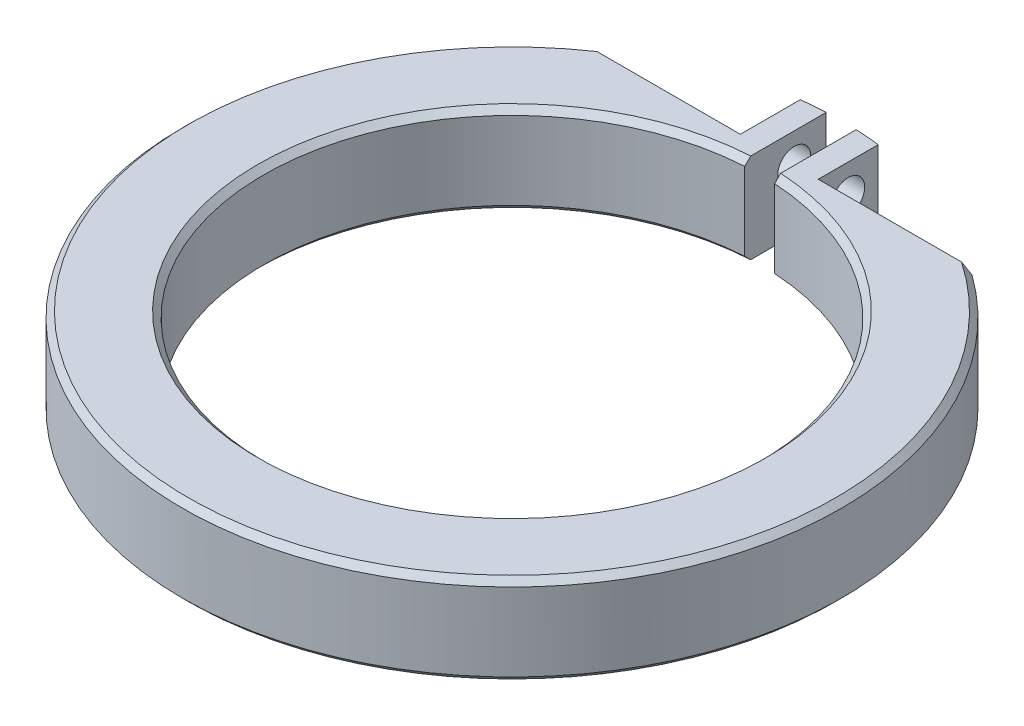
ISO-10303-21;
HEADER;
FILE_DESCRIPTION(('STEP AP214'),'2;1');
FILE_NAME('part.step','',(''),(''),'','','');
FILE_SCHEMA(('AUTOMOTIVE_DESIGN { 1 0 10303 214 1 1 1 1 }'));
ENDSEC;
DATA;
#1=APPLICATION_CONTEXT('core data for automotive mechanical design processes');
#2=APPLICATION_PROTOCOL_DEFINITION('international standard','automotive_design',2000,#1);
#3=PRODUCT_CONTEXT('',#1,'mechanical');
#4=PRODUCT('Part','Part','',(#3));
#5=PRODUCT_RELATED_PRODUCT_CATEGORY('part','',(#4));
#6=PRODUCT_DEFINITION_FORMATION('','',#4);
#7=PRODUCT_DEFINITION_CONTEXT('part definition',#1,'design');
#8=PRODUCT_DEFINITION('design','',#6,#7);
#9=PRODUCT_DEFINITION_SHAPE('','',#8);
#10=(LENGTH_UNIT() NAMED_UNIT(*) SI_UNIT(.MILLI.,.METRE.));
#11=(NAMED_UNIT(*) PLANE_ANGLE_UNIT() SI_UNIT($,.RADIAN.));
#12=(NAMED_UNIT(*) SI_UNIT($,.STERADIAN.) SOLID_ANGLE_UNIT());
#13=UNCERTAINTY_MEASURE_WITH_UNIT(LENGTH_MEASURE(1.E-05),#10,'distance_accuracy_value','');
#14=(GEOMETRIC_REPRESENTATION_CONTEXT(3) GLOBAL_UNCERTAINTY_ASSIGNED_CONTEXT((#13)) GLOBAL_UNIT_ASSIGNED_CONTEXT((#10,
#11,#12)) REPRESENTATION_CONTEXT('',''));
#15=CARTESIAN_POINT('',(0.,0.,0.));
#16=DIRECTION('',(0.,0.,1.));
#17=DIRECTION('',(1.,0.,0.));
#18=AXIS2_PLACEMENT_3D('',#15,#16,#17);
#19=CARTESIAN_POINT('',(0.,15.,0.));
#20=DIRECTION('',(0.,1.,0.));
#21=DIRECTION('',(0.,0.,1.));
#22=AXIS2_PLACEMENT_3D('',#19,#20,#21);
#23=PLANE('',#22);
#24=DIRECTION('',(0.,0.,-1.));
#25=VECTOR('',#24,1.);
#26=CARTESIAN_POINT('',(2.5,15.,-41.3419799507716));
#27=LINE('',#26,#25);
#28=CARTESIAN_POINT('',(2.5,15.,-42.3437634870827));
#29=VERTEX_POINT('',#28);
#30=CARTESIAN_POINT('',(2.50000000000001,15.,-54.9431524395898));
#31=VERTEX_POINT('',#30);
#32=EDGE_CURVE('E186',#29,#31,#27,.T.);
#33=ORIENTED_EDGE('',*,*,#32,.F.);
#34=CARTESIAN_POINT('',(0.,15.,0.));
#35=DIRECTION('',(0.,1.,0.));
#36=DIRECTION('',(0.,0.,1.));
#37=AXIS2_PLACEMENT_3D('',#34,#35,#36);
#38=CIRCLE('',#37,42.4175);
#39=CARTESIAN_POINT('',(-2.5,15.,-42.3437634870827));
#40=VERTEX_POINT('',#39);
#41=EDGE_CURVE('E11',#29,#40,#38,.F.);
#42=ORIENTED_EDGE('',*,*,#41,.T.);
#43=DIRECTION('',(0.,0.,1.));
#44=VECTOR('',#43,1.);
#45=CARTESIAN_POINT('',(-2.5,15.,-41.3419799507716));
#46=LINE('',#45,#44);
#47=CARTESIAN_POINT('',(-2.5,15.,-54.9431524395898));
#48=VERTEX_POINT('',#47);
#49=EDGE_CURVE('E210',#48,#40,#46,.T.);
#50=ORIENTED_EDGE('',*,*,#49,.F.);
#51=CARTESIAN_POINT('',(0.,15.,0.));
#52=DIRECTION('',(0.,1.,0.));
#53=DIRECTION('',(0.,0.,1.));
#54=AXIS2_PLACEMENT_3D('',#51,#52,#53);
#55=CIRCLE('',#54,55.);
#56=CARTESIAN_POINT('',(-6.5,15.,-54.6145584986275));
#57=VERTEX_POINT('',#56);
#58=EDGE_CURVE('E178',#48,#57,#55,.T.);
#59=ORIENTED_EDGE('',*,*,#58,.T.);
#60=DIRECTION('',(0.,0.,-1.));
#61=VECTOR('',#60,1.);
#62=CARTESIAN_POINT('',(-6.5,15.,-54.6145584986275));
#63=LINE('',#62,#61);
#64=CARTESIAN_POINT('',(-6.5,15.,-44.6145584986275));
#65=VERTEX_POINT('',#64);
#66=EDGE_CURVE('E164',#65,#57,#63,.T.);
#67=ORIENTED_EDGE('',*,*,#66,.F.);
#68=DIRECTION('',(1.,0.,0.));
#69=VECTOR('',#68,1.);
#70=CARTESIAN_POINT('',(-6.5,15.,-44.6145584986275));
#71=LINE('',#70,#69);
#72=CARTESIAN_POINT('',(-30.4227081301542,15.,-44.6145584986274));
#73=VERTEX_POINT('',#72);
#74=EDGE_CURVE('E153',#73,#65,#71,.T.);
#75=ORIENTED_EDGE('',*,*,#74,.F.);
#76=CARTESIAN_POINT('',(0.,15.,0.));
#77=DIRECTION('',(0.,1.,0.));
#78=DIRECTION('',(0.,0.,1.));
#79=AXIS2_PLACEMENT_3D('',#76,#77,#78);
#80=CIRCLE('',#79,54.);
#81=CARTESIAN_POINT('',(30.4227081301542,15.,-44.6145584986274));
#82=VERTEX_POINT('',#81);
#83=EDGE_CURVE('E396',#73,#82,#80,.T.);
#84=ORIENTED_EDGE('',*,*,#83,.T.);
#85=DIRECTION('',(1.,0.,0.));
#86=VECTOR('',#85,1.);
#87=CARTESIAN_POINT('',(6.5,15.,-44.6145584986275));
#88=LINE('',#87,#86);
#89=CARTESIAN_POINT('',(6.5,15.,-44.6145584986275));
#90=VERTEX_POINT('',#89);
#91=EDGE_CURVE('E192',#90,#82,#88,.T.);
#92=ORIENTED_EDGE('',*,*,#91,.F.);
#93=DIRECTION('',(0.,0.,1.));
#94=VECTOR('',#93,1.);
#95=CARTESIAN_POINT('',(6.5,15.,-54.6145584986275));
#96=LINE('',#95,#94);
#97=CARTESIAN_POINT('',(6.5,15.,-54.6145584986275));
#98=VERTEX_POINT('',#97);
#99=EDGE_CURVE('E196',#98,#90,#96,.T.);
#100=ORIENTED_EDGE('',*,*,#99,.F.);
#101=EDGE_CURVE('E218',#98,#31,#55,.T.);
#102=ORIENTED_EDGE('',*,*,#101,.T.);
#103=EDGE_LOOP('',(#33,#42,#50,#59,#67,#75,#84,#92,#100,#102));
#104=FACE_BOUND('',#103,.T.);
#105=ADVANCED_FACE('F37',(#104),#23,.T.);
#106=CARTESIAN_POINT('',(0.,0.,0.));
#107=DIRECTION('',(0.,1.,0.));
#108=DIRECTION('',(0.,0.,1.));
#109=AXIS2_PLACEMENT_3D('',#106,#107,#108);
#110=PLANE('',#109);
#111=DIRECTION('',(0.,0.,1.));
#112=VECTOR('',#111,1.);
#113=CARTESIAN_POINT('',(-2.5,0.,-41.3419799507716));
#114=LINE('',#113,#112);
#115=CARTESIAN_POINT('',(-2.5,0.,-53.9420985872815));
#116=VERTEX_POINT('',#115);
#117=CARTESIAN_POINT('',(-2.5,0.,-42.3437634870827));
#118=VERTEX_POINT('',#117);
#119=EDGE_CURVE('E209',#116,#118,#114,.T.);
#120=ORIENTED_EDGE('',*,*,#119,.T.);
#121=CARTESIAN_POINT('',(0.,0.,0.));
#122=DIRECTION('',(0.,1.,0.));
#123=DIRECTION('',(0.,0.,1.));
#124=AXIS2_PLACEMENT_3D('',#121,#122,#123);
#125=CIRCLE('',#124,42.4175);
#126=CARTESIAN_POINT('',(2.5,0.,-42.3437634870827));
#127=VERTEX_POINT('',#126);
#128=EDGE_CURVE('E381',#118,#127,#125,.T.);
#129=ORIENTED_EDGE('',*,*,#128,.T.);
#130=DIRECTION('',(0.,0.,-1.));
#131=VECTOR('',#130,1.);
#132=CARTESIAN_POINT('',(2.5,0.,-41.3419799507716));
#133=LINE('',#132,#131);
#134=CARTESIAN_POINT('',(2.5,0.,-53.9420985872815));
#135=VERTEX_POINT('',#134);
#136=EDGE_CURVE('E207',#127,#135,#133,.T.);
#137=ORIENTED_EDGE('',*,*,#136,.T.);
#138=CARTESIAN_POINT('',(0.,0.,0.));
#139=DIRECTION('',(0.,1.,0.));
#140=DIRECTION('',(0.,0.,1.));
#141=AXIS2_PLACEMENT_3D('',#138,#139,#140);
#142=CIRCLE('',#141,54.);
#143=EDGE_CURVE('E384',#135,#116,#142,.F.);
#144=ORIENTED_EDGE('',*,*,#143,.T.);
#145=EDGE_LOOP('',(#120,#129,#137,#144));
#146=FACE_BOUND('',#145,.T.);
#147=ADVANCED_FACE('F416',(#146),#110,.F.);
#148=CARTESIAN_POINT('',(0.,15.,0.));
#149=DIRECTION('',(0.,-1.,0.));
#150=DIRECTION('',(0.,0.,-1.));
#151=AXIS2_PLACEMENT_3D('',#148,#149,#150);
#152=CYLINDRICAL_SURFACE('',#151,55.);
#153=DIRECTION('',(0.,1.,0.));
#154=VECTOR('',#153,1.);
#155=CARTESIAN_POINT('',(32.1642840736826,5.,-44.6145584986274));
#156=LINE('',#155,#154);
#157=CARTESIAN_POINT('',(32.1642840736826,7.,-44.6145584986274));
#158=VERTEX_POINT('',#157);
#159=CARTESIAN_POINT('',(32.1642840736826,14.,-44.6145584986274));
#160=VERTEX_POINT('',#159);
#161=EDGE_CURVE('E165',#158,#160,#156,.T.);
#162=ORIENTED_EDGE('',*,*,#161,.T.);
#163=CARTESIAN_POINT('',(0.,14.,0.));
#164=DIRECTION('',(0.,1.,0.));
#165=DIRECTION('',(0.,0.,1.));
#166=AXIS2_PLACEMENT_3D('',#163,#164,#165);
#167=CIRCLE('',#166,55.);
#168=CARTESIAN_POINT('',(-32.1642840736826,14.,-44.6145584986274));
#169=VERTEX_POINT('',#168);
#170=EDGE_CURVE('E297',#160,#169,#167,.F.);
#171=ORIENTED_EDGE('',*,*,#170,.T.);
#172=DIRECTION('',(0.,1.,0.));
#173=VECTOR('',#172,1.);
#174=CARTESIAN_POINT('',(-32.1642840736826,5.,-44.6145584986274));
#175=LINE('',#174,#173);
#176=CARTESIAN_POINT('',(-32.1642840736826,7.,-44.6145584986274));
#177=VERTEX_POINT('',#176);
#178=EDGE_CURVE('E174',#177,#169,#175,.T.);
#179=ORIENTED_EDGE('',*,*,#178,.F.);
#180=CARTESIAN_POINT('',(-32.1642840736826,7.,-44.6145584986274));
#181=CARTESIAN_POINT('',(-32.1643007930241,6.95962654996886,-44.6145458588829));
#182=CARTESIAN_POINT('',(-32.1625889999668,6.91926554770767,-44.6157805302863));
#183=CARTESIAN_POINT('',(-32.1558383664156,6.83901869520496,-44.6206464551745));
#184=CARTESIAN_POINT('',(-32.1508037826462,6.79913230342107,-44.6242746423976));
#185=CARTESIAN_POINT('',(-32.1376164344037,6.7206527281823,-44.6337727601258));
#186=CARTESIAN_POINT('',(-32.1295017608624,6.68204977529407,-44.6396153047959));
#187=CARTESIAN_POINT('',(-32.1103702607454,6.6059539996012,-44.6533790601372));
#188=CARTESIAN_POINT('',(-32.0993527118299,6.56846145569297,-44.6613007881821));
#189=CARTESIAN_POINT('',(-32.0624414049865,6.45841174838379,-44.6878144789277));
#190=CARTESIAN_POINT('',(-32.0326055683359,6.38781396457675,-44.7092152345839));
#191=CARTESIAN_POINT('',(-31.9644894091069,6.25290586522998,-44.7579398251131));
#192=CARTESIAN_POINT('',(-31.9261815324406,6.18861707713267,-44.7852829816436));
#193=CARTESIAN_POINT('',(-31.8203085100542,6.0332174427758,-44.8606078665391));
#194=CARTESIAN_POINT('',(-31.7482128027911,5.94670884784141,-44.9116894360233));
#195=CARTESIAN_POINT('',(-31.5937875931604,5.78834388503713,-45.0204571304663));
#196=CARTESIAN_POINT('',(-31.5114378583423,5.71651724795518,-45.0781562944737));
#197=CARTESIAN_POINT('',(-31.3547501014121,5.59710350456871,-45.187245316554));
#198=CARTESIAN_POINT('',(-31.2814946507567,5.54747277963951,-45.2379971710635));
#199=CARTESIAN_POINT('',(-31.1314531874134,5.45604765513646,-45.3413820614901));
#200=CARTESIAN_POINT('',(-31.0546648215676,5.4142585755384,-45.3940163458795));
#201=CARTESIAN_POINT('',(-30.8981822449858,5.33759542300357,-45.5006740409138));
#202=CARTESIAN_POINT('',(-30.8184782061336,5.30274790323949,-45.5547019253211));
#203=CARTESIAN_POINT('',(-30.6570430183275,5.23947550200878,-45.6634996036769));
#204=CARTESIAN_POINT('',(-30.5753113309136,5.21105234729605,-45.7182695929068));
#205=CARTESIAN_POINT('',(-30.3868374511277,5.15283220921085,-45.843825213226));
#206=CARTESIAN_POINT('',(-30.2795908446476,5.12494198124811,-45.9147372344463));
#207=CARTESIAN_POINT('',(-30.0632331561396,5.07792506055661,-46.0566908920685));
#208=CARTESIAN_POINT('',(-29.9541211799253,5.05880270035894,-46.1277325751718));
#209=CARTESIAN_POINT('',(-29.7362916235818,5.0288806120298,-46.2684503752386));
#210=CARTESIAN_POINT('',(-29.6275933720868,5.01795849583825,-46.3381308042381));
#211=CARTESIAN_POINT('',(-29.4094898289416,5.00353665055713,-46.4768615567524));
#212=CARTESIAN_POINT('',(-29.3000855751165,5.00002778026472,-46.5459125516248));
#213=CARTESIAN_POINT('',(-29.1904596739764,5.,-46.6145584986274));
#214=B_SPLINE_CURVE_WITH_KNOTS('',3,(#180,#181,#182,#183,#184,#185,#186,#187,#188,#189,#190,
#191,#192,#193,#194,#195,#196,#197,#198,#199,#200,#201,#202,#203,#204,#205,#206,#207,#208,#209,
#210,#211,#212,#213),.UNSPECIFIED.,.F.,.F.,(4,2,2,2,2,2,2,2,2,2,2,2,2,2,2,2,4),(0.,
0.12104516813012,0.241935569244906,0.361377234494594,0.480848649244449,0.718373440455049,
0.956682414734294,1.32555498811106,1.6951672814864,2.00076537448538,2.30657004946758,
2.61352294044258,2.92055823698864,3.31488348287743,3.70940337016977,4.09791115867101,
4.48593960164287),.UNSPECIFIED.);
#215=CARTESIAN_POINT('',(-29.1904596739764,5.,-46.6145584986274));
#216=VERTEX_POINT('',#215);
#217=EDGE_CURVE('E240',#177,#216,#214,.T.);
#218=ORIENTED_EDGE('',*,*,#217,.T.);
#219=CARTESIAN_POINT('',(0.,5.,0.));
#220=DIRECTION('',(0.,1.,0.));
#221=DIRECTION('',(0.,0.,1.));
#222=AXIS2_PLACEMENT_3D('',#219,#220,#221);
#223=CIRCLE('',#222,55.);
#224=CARTESIAN_POINT('',(-6.5,5.,-54.6145584986275));
#225=VERTEX_POINT('',#224);
#226=EDGE_CURVE('E179',#225,#216,#223,.T.);
#227=ORIENTED_EDGE('',*,*,#226,.F.);
#228=DIRECTION('',(0.,1.,0.));
#229=VECTOR('',#228,1.);
#230=CARTESIAN_POINT('',(-6.5,5.,-54.6145584986275));
#231=LINE('',#230,#229);
#232=EDGE_CURVE('E173',#225,#57,#231,.T.);
#233=ORIENTED_EDGE('',*,*,#232,.T.);
#234=ORIENTED_EDGE('',*,*,#58,.F.);
#235=DIRECTION('',(0.,1.,0.));
#236=VECTOR('',#235,1.);
#237=CARTESIAN_POINT('',(-2.5,0.,-54.9431524395898));
#238=LINE('',#237,#236);
#239=CARTESIAN_POINT('',(-2.5,0.999999999999994,-54.9431524395898));
#240=VERTEX_POINT('',#239);
#241=EDGE_CURVE('E219',#240,#48,#238,.T.);
#242=ORIENTED_EDGE('',*,*,#241,.F.);
#243=CARTESIAN_POINT('',(0.,0.999999999999994,0.));
#244=DIRECTION('',(0.,1.,0.));
#245=DIRECTION('',(0.,0.,1.));
#246=AXIS2_PLACEMENT_3D('',#243,#244,#245);
#247=CIRCLE('',#246,55.);
#248=CARTESIAN_POINT('',(2.50000000000001,0.999999999999994,-54.9431524395898));
#249=VERTEX_POINT('',#248);
#250=EDGE_CURVE('E394',#240,#249,#247,.T.);
#251=ORIENTED_EDGE('',*,*,#250,.T.);
#252=DIRECTION('',(0.,1.,0.));
#253=VECTOR('',#252,1.);
#254=CARTESIAN_POINT('',(2.50000000000001,0.,-54.9431524395898));
#255=LINE('',#254,#253);
#256=EDGE_CURVE('E221',#249,#31,#255,.T.);
#257=ORIENTED_EDGE('',*,*,#256,.T.);
#258=ORIENTED_EDGE('',*,*,#101,.F.);
#259=DIRECTION('',(0.,1.,0.));
#260=VECTOR('',#259,1.);
#261=CARTESIAN_POINT('',(6.5,5.,-54.6145584986275));
#262=LINE('',#261,#260);
#263=CARTESIAN_POINT('',(6.5,5.,-54.6145584986275));
#264=VERTEX_POINT('',#263);
#265=EDGE_CURVE('E195',#264,#98,#262,.T.);
#266=ORIENTED_EDGE('',*,*,#265,.F.);
#267=CARTESIAN_POINT('',(0.,5.,0.));
#268=DIRECTION('',(0.,1.,0.));
#269=DIRECTION('',(0.,0.,-1.));
#270=AXIS2_PLACEMENT_3D('',#267,#268,#269);
#271=CIRCLE('',#270,55.);
#272=CARTESIAN_POINT('',(29.1904596739764,5.,-46.6145584986274));
#273=VERTEX_POINT('',#272);
#274=EDGE_CURVE('E189',#273,#264,#271,.T.);
#275=ORIENTED_EDGE('',*,*,#274,.F.);
#276=CARTESIAN_POINT('',(29.1904596739764,5.,-46.6145584986274));
#277=CARTESIAN_POINT('',(29.2618950582999,5.00000410830266,-46.5698251893079));
#278=CARTESIAN_POINT('',(29.3332214542748,5.00150048570252,-46.5249310861389));
#279=CARTESIAN_POINT('',(29.4755868914035,5.0075763970651,-46.4348670040117));
#280=CARTESIAN_POINT('',(29.5466258737238,5.01215653303706,-46.3896969728934));
#281=CARTESIAN_POINT('',(29.7597310130058,5.03071895077998,-46.2535066736511));
#282=CARTESIAN_POINT('',(29.9012139733787,5.04952488058544,-46.1621640296161));
#283=CARTESIAN_POINT('',(30.182670971722,5.10137602829001,-45.9786345991746));
#284=CARTESIAN_POINT('',(30.3226236335103,5.13453487780392,-45.8864469467475));
#285=CARTESIAN_POINT('',(30.5982104292876,5.21691294581438,-45.7031374911376));
#286=CARTESIAN_POINT('',(30.7338526875045,5.26609970842943,-45.6120139163039));
#287=CARTESIAN_POINT('',(30.9136296618075,5.34558281005282,-45.4901176550028));
#288=CARTESIAN_POINT('',(30.9606118537982,5.36773726369652,-45.4581531074483));
#289=CARTESIAN_POINT('',(31.0535962187872,5.41460931547153,-45.3946839265736));
#290=CARTESIAN_POINT('',(31.0995984037196,5.43932688236891,-45.3631792876545));
#291=CARTESIAN_POINT('',(31.2358324010681,5.51755206138873,-45.2695800291169));
#292=CARTESIAN_POINT('',(31.3243712222158,5.57516652162368,-45.2083460759812));
#293=CARTESIAN_POINT('',(31.4956258256684,5.70344966090385,-45.0892063366155));
#294=CARTESIAN_POINT('',(31.5782840147289,5.77422792917874,-45.0313342782552));
#295=CARTESIAN_POINT('',(31.7336467298936,5.93031105628469,-44.9219837573017));
#296=CARTESIAN_POINT('',(31.8063702734681,6.01558743878918,-44.8704930971201));
#297=CARTESIAN_POINT('',(31.9143565542687,6.16983570890459,-44.7937120687995));
#298=CARTESIAN_POINT('',(31.9539029113345,6.23433491007644,-44.765499859494));
#299=CARTESIAN_POINT('',(32.0245392338627,6.37001782794382,-44.7149948904175));
#300=CARTESIAN_POINT('',(32.0556364037224,6.44119577972369,-44.6926970879768));
#301=CARTESIAN_POINT('',(32.1035804569386,6.5789853609633,-44.6582677032646));
#302=CARTESIAN_POINT('',(32.1218028956664,6.64486834930053,-44.6451569510118));
#303=CARTESIAN_POINT('',(32.1489536197877,6.7794006321575,-44.6256101405288));
#304=CARTESIAN_POINT('',(32.1579050349218,6.84804259636878,-44.6191574715829));
#305=CARTESIAN_POINT('',(32.163494337862,6.94466530757117,-44.6151276772019));
#306=CARTESIAN_POINT('',(32.1642975804329,6.97233836171307,-44.6145483681533));
#307=CARTESIAN_POINT('',(32.1642840736826,7.,-44.6145584986274));
#308=B_SPLINE_CURVE_WITH_KNOTS('',3,(#276,#277,#278,#279,#280,#281,#282,#283,#284,#285,#286,
#287,#288,#289,#290,#291,#292,#293,#294,#295,#296,#297,#298,#299,#300,#301,#302,#303,#304,#305,
#306,#307),.UNSPECIFIED.,.F.,.F.,(4,2,2,2,2,2,2,2,2,2,2,2,2,2,2,4),(0.,0.25282771647522,
0.505704804121882,1.01347651754073,1.52534395540327,2.03618125719,2.21910112323622,
2.40201876049517,2.76754890573759,3.13627064080194,3.5042763492189,3.74577355016985,
3.98706418200524,4.19500426291173,4.40242430726866,4.48542557306862),.UNSPECIFIED.);
#309=EDGE_CURVE('E248',#273,#158,#308,.T.);
#310=ORIENTED_EDGE('',*,*,#309,.T.);
#311=EDGE_LOOP('',(#162,#171,#179,#218,#227,#233,#234,#242,#251,#257,#258,#266,#275,#310));
#312=FACE_BOUND('',#311,.T.);
#313=ADVANCED_FACE('F255',(#312),#152,.T.);
#314=CARTESIAN_POINT('',(0.,15.,0.));
#315=DIRECTION('',(0.,-1.,0.));
#316=DIRECTION('',(0.,0.,-1.));
#317=AXIS2_PLACEMENT_3D('',#314,#315,#316);
#318=CYLINDRICAL_SURFACE('',#317,41.4175);
#319=DIRECTION('',(0.,1.,0.));
#320=VECTOR('',#319,1.);
#321=CARTESIAN_POINT('',(2.5,0.,-41.3419799507716));
#322=LINE('',#321,#320);
#323=CARTESIAN_POINT('',(2.5,0.999999999999973,-41.3419799507716));
#324=VERTEX_POINT('',#323);
#325=CARTESIAN_POINT('',(2.5,14.,-41.3419799507716));
#326=VERTEX_POINT('',#325);
#327=EDGE_CURVE('E213',#324,#326,#322,.T.);
#328=ORIENTED_EDGE('',*,*,#327,.F.);
#329=CARTESIAN_POINT('',(0.,0.999999999999973,0.));
#330=DIRECTION('',(0.,1.,0.));
#331=DIRECTION('',(0.,0.,1.));
#332=AXIS2_PLACEMENT_3D('',#329,#330,#331);
#333=CIRCLE('',#332,41.4175);
#334=CARTESIAN_POINT('',(-2.5,0.999999999999973,-41.3419799507716));
#335=VERTEX_POINT('',#334);
#336=EDGE_CURVE('E344',#324,#335,#333,.F.);
#337=ORIENTED_EDGE('',*,*,#336,.T.);
#338=DIRECTION('',(0.,1.,0.));
#339=VECTOR('',#338,1.);
#340=CARTESIAN_POINT('',(-2.5,0.,-41.3419799507716));
#341=LINE('',#340,#339);
#342=CARTESIAN_POINT('',(-2.5,14.,-41.3419799507716));
#343=VERTEX_POINT('',#342);
#344=EDGE_CURVE('E216',#335,#343,#341,.T.);
#345=ORIENTED_EDGE('',*,*,#344,.T.);
#346=CARTESIAN_POINT('',(0.,14.,0.));
#347=DIRECTION('',(0.,1.,0.));
#348=DIRECTION('',(0.,0.,1.));
#349=AXIS2_PLACEMENT_3D('',#346,#347,#348);
#350=CIRCLE('',#349,41.4175);
#351=EDGE_CURVE('E365',#343,#326,#350,.T.);
#352=ORIENTED_EDGE('',*,*,#351,.T.);
#353=EDGE_LOOP('',(#328,#337,#345,#352));
#354=FACE_BOUND('',#353,.T.);
#355=ADVANCED_FACE('F376',(#354),#318,.F.);
#356=CARTESIAN_POINT('',(2.5,0.,-41.3419799507716));
#357=DIRECTION('',(1.,0.,0.));
#358=DIRECTION('',(0.,0.,-1.));
#359=AXIS2_PLACEMENT_3D('',#356,#357,#358);
#360=PLANE('',#359);
#361=CARTESIAN_POINT('',(2.5,10.,-49.6145584986275));
#362=DIRECTION('',(1.,0.,0.));
#363=DIRECTION('',(0.,0.,-1.));
#364=AXIS2_PLACEMENT_3D('',#361,#362,#363);
#365=CIRCLE('',#364,2.75);
#366=CARTESIAN_POINT('',(2.5,10.,-52.3645584986275));
#367=VERTEX_POINT('',#366);
#368=EDGE_CURVE('E199',#367,#367,#365,.T.);
#369=ORIENTED_EDGE('',*,*,#368,.T.);
#370=EDGE_LOOP('',(#369));
#371=FACE_BOUND('',#370,.T.);
#372=ORIENTED_EDGE('',*,*,#136,.F.);
#373=CARTESIAN_POINT('',(2.5,0.,-42.3437634870827));
#374=CARTESIAN_POINT('',(2.5,0.166670221879675,-42.1768031132481));
#375=CARTESIAN_POINT('',(2.5,0.33333866615273,-42.0098409649716));
#376=CARTESIAN_POINT('',(2.5,0.666671999486055,-41.6759131195346));
#377=CARTESIAN_POINT('',(2.5,0.833336888546325,-41.508947422374));
#378=CARTESIAN_POINT('',(2.5,0.999999999999975,-41.3419799507716));
#379=B_SPLINE_CURVE_WITH_KNOTS('',3,(#373,#374,#375,#376,#377,#378),.UNSPECIFIED.,.F.,.F.,(4,2,
4),(0.,0.707737637448653,1.41547527489923),.UNSPECIFIED.);
#380=EDGE_CURVE('E359',#127,#324,#379,.T.);
#381=ORIENTED_EDGE('',*,*,#380,.T.);
#382=ORIENTED_EDGE('',*,*,#327,.T.);
#383=CARTESIAN_POINT('',(2.5,14.,-41.3419799507716));
#384=CARTESIAN_POINT('',(2.5,14.1666631114536,-41.508947422374));
#385=CARTESIAN_POINT('',(2.5,14.3333280005139,-41.6759131195346));
#386=CARTESIAN_POINT('',(2.5,14.6666613338473,-42.0098409649716));
#387=CARTESIAN_POINT('',(2.5,14.8333297781203,-42.1768031132481));
#388=CARTESIAN_POINT('',(2.5,15.,-42.3437634870827));
#389=B_SPLINE_CURVE_WITH_KNOTS('',3,(#383,#384,#385,#386,#387,#388),.UNSPECIFIED.,.F.,.F.,(4,2,
4),(0.,0.707737637450602,1.41547527489929),.UNSPECIFIED.);
#390=EDGE_CURVE('E366',#326,#29,#389,.T.);
#391=ORIENTED_EDGE('',*,*,#390,.T.);
#392=ORIENTED_EDGE('',*,*,#32,.T.);
#393=ORIENTED_EDGE('',*,*,#256,.F.);
#394=CARTESIAN_POINT('',(2.50000000000001,0.999999999999994,-54.9431524395898));
#395=CARTESIAN_POINT('',(2.50000000000001,0.83333171939114,-54.7763117431149));
#396=CARTESIAN_POINT('',(2.5,0.666664245753398,-54.6094702405185));
#397=CARTESIAN_POINT('',(2.5,0.333330912420066,-54.2757856230824));
#398=CARTESIAN_POINT('',(2.5,0.166665052724476,-54.1089425082428));
#399=CARTESIAN_POINT('',(2.5,0.,-53.9420985872815));
#400=B_SPLINE_CURVE_WITH_KNOTS('',3,(#394,#395,#396,#397,#398,#399),.UNSPECIFIED.,.F.,.F.,(4,2,
4),(0.,0.707479472364236,1.41495894472878),.UNSPECIFIED.);
#401=EDGE_CURVE('E296',#249,#135,#400,.T.);
#402=ORIENTED_EDGE('',*,*,#401,.T.);
#403=EDGE_LOOP('',(#372,#381,#382,#391,#392,#393,#402));
#404=FACE_BOUND('',#403,.T.);
#405=ADVANCED_FACE('F325',(#371,#404),#360,.F.);
#406=CARTESIAN_POINT('',(-2.5,0.,-41.3419799507716));
#407=DIRECTION('',(-1.,0.,0.));
#408=DIRECTION('',(0.,0.,1.));
#409=AXIS2_PLACEMENT_3D('',#406,#407,#408);
#410=PLANE('',#409);
#411=CARTESIAN_POINT('',(-2.5,10.,-49.6145584986274));
#412=DIRECTION('',(-1.,0.,0.));
#413=DIRECTION('',(0.,0.,1.));
#414=AXIS2_PLACEMENT_3D('',#411,#412,#413);
#415=CIRCLE('',#414,2.75);
#416=CARTESIAN_POINT('',(-2.5,10.,-46.8645584986274));
#417=VERTEX_POINT('',#416);
#418=EDGE_CURVE('E554',#417,#417,#415,.T.);
#419=ORIENTED_EDGE('',*,*,#418,.T.);
#420=EDGE_LOOP('',(#419));
#421=FACE_BOUND('',#420,.T.);
#422=ORIENTED_EDGE('',*,*,#344,.F.);
#423=CARTESIAN_POINT('',(-2.5,0.999999999999973,-41.3419799507716));
#424=CARTESIAN_POINT('',(-2.5,0.833336888546325,-41.508947422374));
#425=CARTESIAN_POINT('',(-2.5,0.666671999486057,-41.6759131195346));
#426=CARTESIAN_POINT('',(-2.5,0.333338666152733,-42.0098409649716));
#427=CARTESIAN_POINT('',(-2.5,0.166670221879677,-42.1768031132481));
#428=CARTESIAN_POINT('',(-2.5,0.,-42.3437634870827));
#429=B_SPLINE_CURVE_WITH_KNOTS('',3,(#423,#424,#425,#426,#427,#428),.UNSPECIFIED.,.F.,.F.,(4,2,
4),(0.,0.70773763745057,1.41547527489923),.UNSPECIFIED.);
#430=EDGE_CURVE('E47',#335,#118,#429,.T.);
#431=ORIENTED_EDGE('',*,*,#430,.T.);
#432=ORIENTED_EDGE('',*,*,#119,.F.);
#433=CARTESIAN_POINT('',(-2.5,0.,-53.9420985872815));
#434=CARTESIAN_POINT('',(-2.5,0.166665052724475,-54.1089425082428));
#435=CARTESIAN_POINT('',(-2.5,0.333330912420064,-54.2757856230824));
#436=CARTESIAN_POINT('',(-2.5,0.666664245753395,-54.6094702405185));
#437=CARTESIAN_POINT('',(-2.5,0.833331719391138,-54.7763117431149));
#438=CARTESIAN_POINT('',(-2.5,0.999999999999994,-54.9431524395898));
#439=B_SPLINE_CURVE_WITH_KNOTS('',3,(#433,#434,#435,#436,#437,#438),.UNSPECIFIED.,.F.,.F.,(4,2,
4),(0.,0.707479472364545,1.41495894472878),.UNSPECIFIED.);
#440=EDGE_CURVE('E332',#116,#240,#439,.T.);
#441=ORIENTED_EDGE('',*,*,#440,.T.);
#442=ORIENTED_EDGE('',*,*,#241,.T.);
#443=ORIENTED_EDGE('',*,*,#49,.T.);
#444=CARTESIAN_POINT('',(-2.5,15.,-42.3437634870827));
#445=CARTESIAN_POINT('',(-2.5,14.8333297781203,-42.1768031132481));
#446=CARTESIAN_POINT('',(-2.5,14.6666613338473,-42.0098409649716));
#447=CARTESIAN_POINT('',(-2.5,14.3333280005139,-41.6759131195346));
#448=CARTESIAN_POINT('',(-2.5,14.1666631114536,-41.508947422374));
#449=CARTESIAN_POINT('',(-2.5,14.,-41.3419799507716));
#450=B_SPLINE_CURVE_WITH_KNOTS('',3,(#444,#445,#446,#447,#448,#449),.UNSPECIFIED.,.F.,.F.,(4,2,
4),(0.,0.707737637448692,1.41547527489929),.UNSPECIFIED.);
#451=EDGE_CURVE('E59',#40,#343,#450,.T.);
#452=ORIENTED_EDGE('',*,*,#451,.T.);
#453=EDGE_LOOP('',(#422,#431,#432,#441,#442,#443,#452));
#454=FACE_BOUND('',#453,.T.);
#455=ADVANCED_FACE('F318',(#421,#454),#410,.F.);
#456=CARTESIAN_POINT('',(6.5,5.,-44.6145584986275));
#457=DIRECTION('',(0.,0.,1.));
#458=DIRECTION('',(1.,0.,0.));
#459=AXIS2_PLACEMENT_3D('',#456,#457,#458);
#460=PLANE('',#459);
#461=ORIENTED_EDGE('',*,*,#91,.T.);
#462=CARTESIAN_POINT('',(30.4227081301542,15.,-44.6145584986274));
#463=CARTESIAN_POINT('',(30.7143132558915,14.8356712441181,-44.6145584986274));
#464=CARTESIAN_POINT('',(31.0052471688844,14.6701735202692,-44.6145584986274));
#465=CARTESIAN_POINT('',(31.5857724829943,14.3368401862401,-44.6145584986274));
#466=CARTESIAN_POINT('',(31.8753638845109,14.1690045767556,-44.6145584986274));
#467=CARTESIAN_POINT('',(32.1642840736826,14.,-44.6145584986274));
#468=B_SPLINE_CURVE_WITH_KNOTS('',3,(#462,#463,#464,#465,#466,#467),.UNSPECIFIED.,.F.,.F.,(4,2,
4),(0.,1.00413562079871,2.00827094274987),.UNSPECIFIED.);
#469=EDGE_CURVE('E281',#82,#160,#468,.T.);
#470=ORIENTED_EDGE('',*,*,#469,.T.);
#471=ORIENTED_EDGE('',*,*,#161,.F.);
#472=DIRECTION('',(1.,0.,0.));
#473=VECTOR('',#472,1.);
#474=CARTESIAN_POINT('',(6.5,7.,-44.6145584986275));
#475=LINE('',#474,#473);
#476=CARTESIAN_POINT('',(6.5,7.,-44.6145584986275));
#477=VERTEX_POINT('',#476);
#478=EDGE_CURVE('E236',#158,#477,#475,.F.);
#479=ORIENTED_EDGE('',*,*,#478,.T.);
#480=DIRECTION('',(0.,1.,0.));
#481=VECTOR('',#480,1.);
#482=CARTESIAN_POINT('',(6.5,5.,-44.6145584986275));
#483=LINE('',#482,#481);
#484=EDGE_CURVE('E204',#477,#90,#483,.T.);
#485=ORIENTED_EDGE('',*,*,#484,.T.);
#486=EDGE_LOOP('',(#461,#470,#471,#479,#485));
#487=FACE_BOUND('',#486,.T.);
#488=ADVANCED_FACE('F314',(#487),#460,.F.);
#489=CARTESIAN_POINT('',(6.5,5.,-54.6145584986275));
#490=DIRECTION('',(-1.,0.,0.));
#491=DIRECTION('',(0.,0.,1.));
#492=AXIS2_PLACEMENT_3D('',#489,#490,#491);
#493=PLANE('',#492);
#494=CARTESIAN_POINT('',(6.5,10.,-49.6145584986275));
#495=DIRECTION('',(-1.,0.,0.));
#496=DIRECTION('',(0.,0.,1.));
#497=AXIS2_PLACEMENT_3D('',#494,#495,#496);
#498=CIRCLE('',#497,2.75);
#499=CARTESIAN_POINT('',(6.5,10.,-46.8645584986275));
#500=VERTEX_POINT('',#499);
#501=EDGE_CURVE('E551',#500,#500,#498,.T.);
#502=ORIENTED_EDGE('',*,*,#501,.T.);
#503=EDGE_LOOP('',(#502));
#504=FACE_BOUND('',#503,.T.);
#505=ORIENTED_EDGE('',*,*,#484,.F.);
#506=CARTESIAN_POINT('',(6.5,7.,-46.6145584986275));
#507=DIRECTION('',(-1.,0.,0.));
#508=DIRECTION('',(0.,0.,1.));
#509=AXIS2_PLACEMENT_3D('',#506,#507,#508);
#510=CIRCLE('',#509,2.);
#511=CARTESIAN_POINT('',(6.5,5.,-46.6145584986275));
#512=VERTEX_POINT('',#511);
#513=EDGE_CURVE('E238',#477,#512,#510,.F.);
#514=ORIENTED_EDGE('',*,*,#513,.T.);
#515=DIRECTION('',(0.,0.,1.));
#516=VECTOR('',#515,1.);
#517=CARTESIAN_POINT('',(6.5,5.,-54.6145584986275));
#518=LINE('',#517,#516);
#519=EDGE_CURVE('E191',#264,#512,#518,.T.);
#520=ORIENTED_EDGE('',*,*,#519,.F.);
#521=ORIENTED_EDGE('',*,*,#265,.T.);
#522=ORIENTED_EDGE('',*,*,#99,.T.);
#523=EDGE_LOOP('',(#505,#514,#520,#521,#522));
#524=FACE_BOUND('',#523,.T.);
#525=ADVANCED_FACE('F312',(#504,#524),#493,.F.);
#526=CARTESIAN_POINT('',(0.,5.,0.));
#527=DIRECTION('',(0.,-1.,0.));
#528=DIRECTION('',(0.,0.,-1.));
#529=AXIS2_PLACEMENT_3D('',#526,#527,#528);
#530=PLANE('',#529);
#531=ORIENTED_EDGE('',*,*,#519,.T.);
#532=DIRECTION('',(1.,0.,0.));
#533=VECTOR('',#532,1.);
#534=CARTESIAN_POINT('',(32.1642840736826,5.,-46.6145584986274));
#535=LINE('',#534,#533);
#536=EDGE_CURVE('E233',#512,#273,#535,.T.);
#537=ORIENTED_EDGE('',*,*,#536,.T.);
#538=ORIENTED_EDGE('',*,*,#274,.T.);
#539=EDGE_LOOP('',(#531,#537,#538));
#540=FACE_BOUND('',#539,.T.);
#541=ADVANCED_FACE('F310',(#540),#530,.F.);
#542=CARTESIAN_POINT('',(-6.5,5.,-54.6145584986275));
#543=DIRECTION('',(1.,0.,0.));
#544=DIRECTION('',(0.,0.,-1.));
#545=AXIS2_PLACEMENT_3D('',#542,#543,#544);
#546=PLANE('',#545);
#547=CARTESIAN_POINT('',(-6.50000000000002,10.,-49.6145584986274));
#548=DIRECTION('',(-1.,0.,0.));
#549=DIRECTION('',(0.,0.,1.));
#550=AXIS2_PLACEMENT_3D('',#547,#548,#549);
#551=CIRCLE('',#550,2.75);
#552=CARTESIAN_POINT('',(-6.50000000000002,10.,-46.8645584986274));
#553=VERTEX_POINT('',#552);
#554=EDGE_CURVE('E550',#553,#553,#551,.T.);
#555=ORIENTED_EDGE('',*,*,#554,.F.);
#556=EDGE_LOOP('',(#555));
#557=FACE_BOUND('',#556,.T.);
#558=DIRECTION('',(0.,0.,-1.));
#559=VECTOR('',#558,1.);
#560=CARTESIAN_POINT('',(-6.5,5.,-54.6145584986275));
#561=LINE('',#560,#559);
#562=CARTESIAN_POINT('',(-6.5,5.,-46.6145584986275));
#563=VERTEX_POINT('',#562);
#564=EDGE_CURVE('E182',#563,#225,#561,.T.);
#565=ORIENTED_EDGE('',*,*,#564,.F.);
#566=CARTESIAN_POINT('',(-6.5,7.,-46.6145584986275));
#567=DIRECTION('',(1.,0.,0.));
#568=DIRECTION('',(0.,0.,-1.));
#569=AXIS2_PLACEMENT_3D('',#566,#567,#568);
#570=CIRCLE('',#569,2.);
#571=CARTESIAN_POINT('',(-6.5,7.,-44.6145584986275));
#572=VERTEX_POINT('',#571);
#573=EDGE_CURVE('E172',#563,#572,#570,.F.);
#574=ORIENTED_EDGE('',*,*,#573,.T.);
#575=DIRECTION('',(0.,1.,0.));
#576=VECTOR('',#575,1.);
#577=CARTESIAN_POINT('',(-6.5,5.,-44.6145584986275));
#578=LINE('',#577,#576);
#579=EDGE_CURVE('E157',#572,#65,#578,.T.);
#580=ORIENTED_EDGE('',*,*,#579,.T.);
#581=ORIENTED_EDGE('',*,*,#66,.T.);
#582=ORIENTED_EDGE('',*,*,#232,.F.);
#583=EDGE_LOOP('',(#565,#574,#580,#581,#582));
#584=FACE_BOUND('',#583,.T.);
#585=ADVANCED_FACE('F169',(#557,#584),#546,.F.);
#586=CARTESIAN_POINT('',(-6.5,5.,-44.6145584986275));
#587=DIRECTION('',(0.,0.,1.));
#588=DIRECTION('',(1.,0.,0.));
#589=AXIS2_PLACEMENT_3D('',#586,#587,#588);
#590=PLANE('',#589);
#591=ORIENTED_EDGE('',*,*,#178,.T.);
#592=CARTESIAN_POINT('',(-32.1642840736826,14.,-44.6145584986274));
#593=CARTESIAN_POINT('',(-31.8753638845109,14.1690045767556,-44.6145584986274));
#594=CARTESIAN_POINT('',(-31.5857724829943,14.3368401862401,-44.6145584986274));
#595=CARTESIAN_POINT('',(-31.0052471688844,14.6701735202692,-44.6145584986274));
#596=CARTESIAN_POINT('',(-30.7143132558915,14.8356712441181,-44.6145584986274));
#597=CARTESIAN_POINT('',(-30.4227081301542,15.,-44.6145584986274));
#598=B_SPLINE_CURVE_WITH_KNOTS('',3,(#592,#593,#594,#595,#596,#597),.UNSPECIFIED.,.F.,.F.,(4,2,
4),(0.,1.00413532195116,2.00827094274987),.UNSPECIFIED.);
#599=EDGE_CURVE('E160',#169,#73,#598,.T.);
#600=ORIENTED_EDGE('',*,*,#599,.T.);
#601=ORIENTED_EDGE('',*,*,#74,.T.);
#602=ORIENTED_EDGE('',*,*,#579,.F.);
#603=DIRECTION('',(1.,0.,0.));
#604=VECTOR('',#603,1.);
#605=CARTESIAN_POINT('',(-6.5,7.,-44.6145584986275));
#606=LINE('',#605,#604);
#607=EDGE_CURVE('E231',#572,#177,#606,.F.);
#608=ORIENTED_EDGE('',*,*,#607,.T.);
#609=EDGE_LOOP('',(#591,#600,#601,#602,#608));
#610=FACE_BOUND('',#609,.T.);
#611=ADVANCED_FACE('F156',(#610),#590,.F.);
#612=CARTESIAN_POINT('',(0.,5.,0.));
#613=DIRECTION('',(0.,1.,0.));
#614=DIRECTION('',(0.,0.,1.));
#615=AXIS2_PLACEMENT_3D('',#612,#613,#614);
#616=PLANE('',#615);
#617=ORIENTED_EDGE('',*,*,#226,.T.);
#618=DIRECTION('',(1.,0.,0.));
#619=VECTOR('',#618,1.);
#620=CARTESIAN_POINT('',(0.,5.,-46.6145584986275));
#621=LINE('',#620,#619);
#622=EDGE_CURVE('E227',#216,#563,#621,.T.);
#623=ORIENTED_EDGE('',*,*,#622,.T.);
#624=ORIENTED_EDGE('',*,*,#564,.T.);
#625=EDGE_LOOP('',(#617,#623,#624));
#626=FACE_BOUND('',#625,.T.);
#627=ADVANCED_FACE('F308',(#626),#616,.T.);
#628=CARTESIAN_POINT('',(55.,10.,-49.6145584986275));
#629=DIRECTION('',(-1.,0.,0.));
#630=DIRECTION('',(0.,0.,1.));
#631=AXIS2_PLACEMENT_3D('',#628,#629,#630);
#632=CYLINDRICAL_SURFACE('',#631,2.75);
#633=ORIENTED_EDGE('',*,*,#554,.T.);
#634=EDGE_LOOP('',(#633));
#635=FACE_BOUND('',#634,.T.);
#636=ORIENTED_EDGE('',*,*,#418,.F.);
#637=EDGE_LOOP('',(#636));
#638=FACE_BOUND('',#637,.T.);
#639=ADVANCED_FACE('F490',(#635,#638),#632,.F.);
#640=ORIENTED_EDGE('',*,*,#501,.F.);
#641=EDGE_LOOP('',(#640));
#642=FACE_BOUND('',#641,.T.);
#643=ORIENTED_EDGE('',*,*,#368,.F.);
#644=EDGE_LOOP('',(#643));
#645=FACE_BOUND('',#644,.T.);
#646=ADVANCED_FACE('F262',(#642,#645),#632,.F.);
#647=CARTESIAN_POINT('',(0.,7.,-46.6145584986275));
#648=DIRECTION('',(1.,0.,0.));
#649=DIRECTION('',(0.,0.,-1.));
#650=AXIS2_PLACEMENT_3D('',#647,#648,#649);
#651=CYLINDRICAL_SURFACE('',#650,2.);
#652=ORIENTED_EDGE('',*,*,#217,.F.);
#653=ORIENTED_EDGE('',*,*,#607,.F.);
#654=ORIENTED_EDGE('',*,*,#573,.F.);
#655=ORIENTED_EDGE('',*,*,#622,.F.);
#656=EDGE_LOOP('',(#652,#653,#654,#655));
#657=FACE_BOUND('',#656,.T.);
#658=ADVANCED_FACE('F258',(#657),#651,.F.);
#659=CARTESIAN_POINT('',(0.,7.,-46.6145584986275));
#660=DIRECTION('',(-1.,0.,0.));
#661=DIRECTION('',(0.,0.,1.));
#662=AXIS2_PLACEMENT_3D('',#659,#660,#661);
#663=CYLINDRICAL_SURFACE('',#662,2.);
#664=ORIENTED_EDGE('',*,*,#513,.F.);
#665=ORIENTED_EDGE('',*,*,#478,.F.);
#666=ORIENTED_EDGE('',*,*,#309,.F.);
#667=ORIENTED_EDGE('',*,*,#536,.F.);
#668=EDGE_LOOP('',(#664,#665,#666,#667));
#669=FACE_BOUND('',#668,.T.);
#670=ADVANCED_FACE('F261',(#669),#663,.F.);
#671=CARTESIAN_POINT('',(0.,15.,0.));
#672=DIRECTION('',(0.,-1.,0.));
#673=DIRECTION('',(0.,0.,-1.));
#674=AXIS2_PLACEMENT_3D('',#671,#672,#673);
#675=CONICAL_SURFACE('',#674,54.,0.785398163397448);
#676=ORIENTED_EDGE('',*,*,#599,.F.);
#677=ORIENTED_EDGE('',*,*,#170,.F.);
#678=ORIENTED_EDGE('',*,*,#469,.F.);
#679=ORIENTED_EDGE('',*,*,#83,.F.);
#680=EDGE_LOOP('',(#676,#677,#678,#679));
#681=FACE_BOUND('',#680,.T.);
#682=ADVANCED_FACE('F267',(#681),#675,.T.);
#683=CARTESIAN_POINT('',(0.,0.999999999999994,0.));
#684=DIRECTION('',(0.,1.,0.));
#685=DIRECTION('',(0.,0.,1.));
#686=AXIS2_PLACEMENT_3D('',#683,#684,#685);
#687=CONICAL_SURFACE('',#686,55.,0.785398163397445);
#688=ORIENTED_EDGE('',*,*,#440,.F.);
#689=ORIENTED_EDGE('',*,*,#143,.F.);
#690=ORIENTED_EDGE('',*,*,#401,.F.);
#691=ORIENTED_EDGE('',*,*,#250,.F.);
#692=EDGE_LOOP('',(#688,#689,#690,#691));
#693=FACE_BOUND('',#692,.T.);
#694=ADVANCED_FACE('F276',(#693),#687,.T.);
#695=CARTESIAN_POINT('',(0.,0.,0.));
#696=DIRECTION('',(0.,-1.,0.));
#697=DIRECTION('',(0.,0.,-1.));
#698=AXIS2_PLACEMENT_3D('',#695,#696,#697);
#699=CONICAL_SURFACE('',#698,42.4175,0.785398163397448);
#700=ORIENTED_EDGE('',*,*,#430,.F.);
#701=ORIENTED_EDGE('',*,*,#336,.F.);
#702=ORIENTED_EDGE('',*,*,#380,.F.);
#703=ORIENTED_EDGE('',*,*,#128,.F.);
#704=EDGE_LOOP('',(#700,#701,#702,#703));
#705=FACE_BOUND('',#704,.T.);
#706=ADVANCED_FACE('F351',(#705),#699,.F.);
#707=CARTESIAN_POINT('',(0.,14.,0.));
#708=DIRECTION('',(0.,1.,0.));
#709=DIRECTION('',(0.,0.,1.));
#710=AXIS2_PLACEMENT_3D('',#707,#708,#709);
#711=CONICAL_SURFACE('',#710,41.4175,0.785398163397445);
#712=ORIENTED_EDGE('',*,*,#451,.F.);
#713=ORIENTED_EDGE('',*,*,#41,.F.);
#714=ORIENTED_EDGE('',*,*,#390,.F.);
#715=ORIENTED_EDGE('',*,*,#351,.F.);
#716=EDGE_LOOP('',(#712,#713,#714,#715));
#717=FACE_BOUND('',#716,.T.);
#718=ADVANCED_FACE('F40',(#717),#711,.F.);
#719=CLOSED_SHELL('',(#105,#147,#313,#355,#405,#455,#488,#525,#541,#585,#611,#627,#639,#646,
#658,#670,#682,#694,#706,#718));
#720=MANIFOLD_SOLID_BREP('B2',#719);
#721=ADVANCED_BREP_SHAPE_REPRESENTATION('',(#18,#720),#14);
#722=SHAPE_DEFINITION_REPRESENTATION(#9,#721);
ENDSEC;
END-ISO-10303-21;
